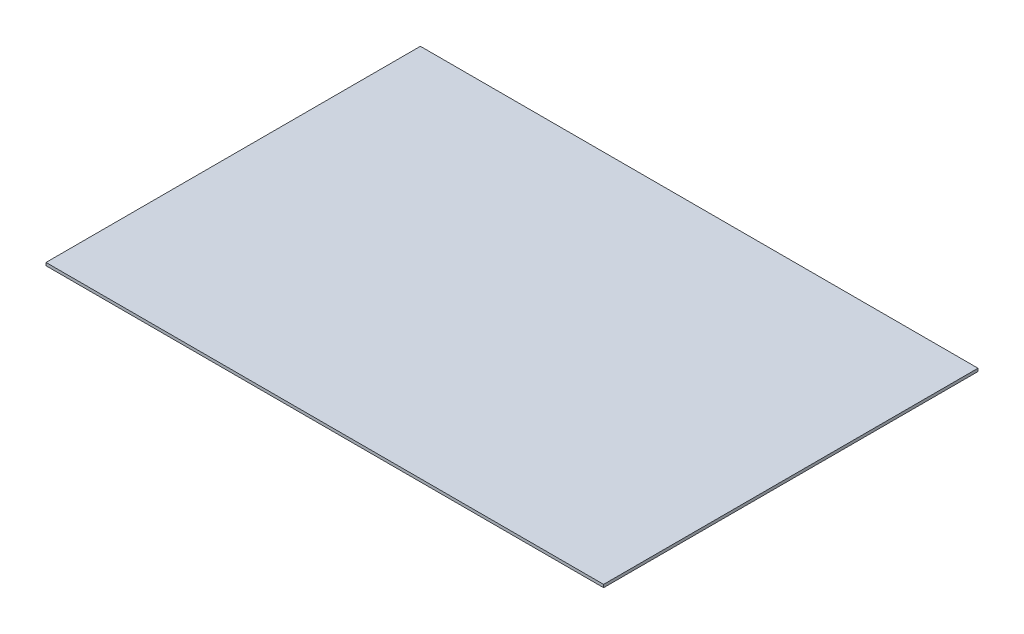
ISO-10303-21;
HEADER;
FILE_DESCRIPTION(('STEP AP214'),'2;1');
FILE_NAME('part.step','',(''),(''),'','','');
FILE_SCHEMA(('AUTOMOTIVE_DESIGN { 1 0 10303 214 1 1 1 1 }'));
ENDSEC;
DATA;
#1=APPLICATION_CONTEXT('core data for automotive mechanical design processes');
#2=APPLICATION_PROTOCOL_DEFINITION('international standard','automotive_design',2000,#1);
#3=PRODUCT_CONTEXT('',#1,'mechanical');
#4=PRODUCT('Part','Part','',(#3));
#5=PRODUCT_RELATED_PRODUCT_CATEGORY('part','',(#4));
#6=PRODUCT_DEFINITION_FORMATION('','',#4);
#7=PRODUCT_DEFINITION_CONTEXT('part definition',#1,'design');
#8=PRODUCT_DEFINITION('design','',#6,#7);
#9=PRODUCT_DEFINITION_SHAPE('','',#8);
#10=(LENGTH_UNIT() NAMED_UNIT(*) SI_UNIT(.MILLI.,.METRE.));
#11=(NAMED_UNIT(*) PLANE_ANGLE_UNIT() SI_UNIT($,.RADIAN.));
#12=(NAMED_UNIT(*) SI_UNIT($,.STERADIAN.) SOLID_ANGLE_UNIT());
#13=UNCERTAINTY_MEASURE_WITH_UNIT(LENGTH_MEASURE(1.E-05),#10,'distance_accuracy_value','');
#14=(GEOMETRIC_REPRESENTATION_CONTEXT(3) GLOBAL_UNCERTAINTY_ASSIGNED_CONTEXT((#13)) GLOBAL_UNIT_ASSIGNED_CONTEXT((#10,
#11,#12)) REPRESENTATION_CONTEXT('',''));
#15=CARTESIAN_POINT('',(0.,0.,0.));
#16=DIRECTION('',(0.,0.,1.));
#17=DIRECTION('',(1.,0.,0.));
#18=AXIS2_PLACEMENT_3D('',#15,#16,#17);
#19=CARTESIAN_POINT('',(456.504,-2.38125,0.));
#20=DIRECTION('',(1.,0.,0.));
#21=DIRECTION('',(0.,0.,-1.));
#22=AXIS2_PLACEMENT_3D('',#19,#20,#21);
#23=PLANE('',#22);
#24=DIRECTION('',(0.,0.,-1.));
#25=VECTOR('',#24,1.);
#26=CARTESIAN_POINT('',(456.504,2.38125,0.));
#27=LINE('',#26,#25);
#28=CARTESIAN_POINT('',(456.504,2.38125,306.504));
#29=VERTEX_POINT('',#28);
#30=CARTESIAN_POINT('',(456.504,2.38125,-306.504));
#31=VERTEX_POINT('',#30);
#32=EDGE_CURVE('E10',#29,#31,#27,.T.);
#33=ORIENTED_EDGE('',*,*,#32,.F.);
#34=DIRECTION('',(0.,1.,0.));
#35=VECTOR('',#34,1.);
#36=CARTESIAN_POINT('',(456.504,-2.38125,306.504));
#37=LINE('',#36,#35);
#38=CARTESIAN_POINT('',(456.504,-2.38125,306.504));
#39=VERTEX_POINT('',#38);
#40=EDGE_CURVE('E23',#39,#29,#37,.T.);
#41=ORIENTED_EDGE('',*,*,#40,.F.);
#42=DIRECTION('',(0.,0.,-1.));
#43=VECTOR('',#42,1.);
#44=CARTESIAN_POINT('',(456.504,-2.38125,0.));
#45=LINE('',#44,#43);
#46=CARTESIAN_POINT('',(456.504,-2.38125,-306.504));
#47=VERTEX_POINT('',#46);
#48=EDGE_CURVE('E85',#39,#47,#45,.T.);
#49=ORIENTED_EDGE('',*,*,#48,.T.);
#50=DIRECTION('',(0.,1.,0.));
#51=VECTOR('',#50,1.);
#52=CARTESIAN_POINT('',(456.504,-2.38125,-306.504));
#53=LINE('',#52,#51);
#54=EDGE_CURVE('E68',#47,#31,#53,.T.);
#55=ORIENTED_EDGE('',*,*,#54,.T.);
#56=EDGE_LOOP('',(#33,#41,#49,#55));
#57=FACE_BOUND('',#56,.T.);
#58=ADVANCED_FACE('F16',(#57),#23,.T.);
#59=CARTESIAN_POINT('',(0.,-2.38125,306.504));
#60=DIRECTION('',(0.,0.,-1.));
#61=DIRECTION('',(-1.,0.,0.));
#62=AXIS2_PLACEMENT_3D('',#59,#60,#61);
#63=PLANE('',#62);
#64=DIRECTION('',(-1.,0.,0.));
#65=VECTOR('',#64,1.);
#66=CARTESIAN_POINT('',(0.,2.38125,306.504));
#67=LINE('',#66,#65);
#68=CARTESIAN_POINT('',(-456.504,2.38125,306.504));
#69=VERTEX_POINT('',#68);
#70=EDGE_CURVE('E82',#29,#69,#67,.T.);
#71=ORIENTED_EDGE('',*,*,#70,.T.);
#72=DIRECTION('',(0.,1.,0.));
#73=VECTOR('',#72,1.);
#74=CARTESIAN_POINT('',(-456.504,-2.38125,306.504));
#75=LINE('',#74,#73);
#76=CARTESIAN_POINT('',(-456.504,-2.38125,306.504));
#77=VERTEX_POINT('',#76);
#78=EDGE_CURVE('E80',#77,#69,#75,.T.);
#79=ORIENTED_EDGE('',*,*,#78,.F.);
#80=DIRECTION('',(-1.,0.,0.));
#81=VECTOR('',#80,1.);
#82=CARTESIAN_POINT('',(0.,-2.38125,306.504));
#83=LINE('',#82,#81);
#84=EDGE_CURVE('E74',#39,#77,#83,.T.);
#85=ORIENTED_EDGE('',*,*,#84,.F.);
#86=ORIENTED_EDGE('',*,*,#40,.T.);
#87=EDGE_LOOP('',(#71,#79,#85,#86));
#88=FACE_BOUND('',#87,.T.);
#89=ADVANCED_FACE('F88',(#88),#63,.F.);
#90=CARTESIAN_POINT('',(-456.504,-2.38125,0.));
#91=DIRECTION('',(1.,0.,0.));
#92=DIRECTION('',(0.,0.,-1.));
#93=AXIS2_PLACEMENT_3D('',#90,#91,#92);
#94=PLANE('',#93);
#95=DIRECTION('',(0.,0.,-1.));
#96=VECTOR('',#95,1.);
#97=CARTESIAN_POINT('',(-456.504,2.38125,0.));
#98=LINE('',#97,#96);
#99=CARTESIAN_POINT('',(-456.504,2.38125,-306.504));
#100=VERTEX_POINT('',#99);
#101=EDGE_CURVE('E59',#69,#100,#98,.T.);
#102=ORIENTED_EDGE('',*,*,#101,.T.);
#103=DIRECTION('',(0.,1.,0.));
#104=VECTOR('',#103,1.);
#105=CARTESIAN_POINT('',(-456.504,-2.38125,-306.504));
#106=LINE('',#105,#104);
#107=CARTESIAN_POINT('',(-456.504,-2.38125,-306.504));
#108=VERTEX_POINT('',#107);
#109=EDGE_CURVE('E51',#108,#100,#106,.T.);
#110=ORIENTED_EDGE('',*,*,#109,.F.);
#111=DIRECTION('',(0.,0.,-1.));
#112=VECTOR('',#111,1.);
#113=CARTESIAN_POINT('',(-456.504,-2.38125,0.));
#114=LINE('',#113,#112);
#115=EDGE_CURVE('E56',#77,#108,#114,.T.);
#116=ORIENTED_EDGE('',*,*,#115,.F.);
#117=ORIENTED_EDGE('',*,*,#78,.T.);
#118=EDGE_LOOP('',(#102,#110,#116,#117));
#119=FACE_BOUND('',#118,.T.);
#120=ADVANCED_FACE('F53',(#119),#94,.F.);
#121=CARTESIAN_POINT('',(0.,-2.38125,-306.504));
#122=DIRECTION('',(0.,0.,-1.));
#123=DIRECTION('',(-1.,0.,0.));
#124=AXIS2_PLACEMENT_3D('',#121,#122,#123);
#125=PLANE('',#124);
#126=DIRECTION('',(-1.,0.,0.));
#127=VECTOR('',#126,1.);
#128=CARTESIAN_POINT('',(0.,2.38125,-306.504));
#129=LINE('',#128,#127);
#130=EDGE_CURVE('E71',#31,#100,#129,.T.);
#131=ORIENTED_EDGE('',*,*,#130,.F.);
#132=ORIENTED_EDGE('',*,*,#54,.F.);
#133=DIRECTION('',(-1.,0.,0.));
#134=VECTOR('',#133,1.);
#135=CARTESIAN_POINT('',(0.,-2.38125,-306.504));
#136=LINE('',#135,#134);
#137=EDGE_CURVE('E66',#47,#108,#136,.T.);
#138=ORIENTED_EDGE('',*,*,#137,.T.);
#139=ORIENTED_EDGE('',*,*,#109,.T.);
#140=EDGE_LOOP('',(#131,#132,#138,#139));
#141=FACE_BOUND('',#140,.T.);
#142=ADVANCED_FACE('F67',(#141),#125,.T.);
#143=CARTESIAN_POINT('',(0.,-2.38125,-1.11022302462516E-13));
#144=DIRECTION('',(0.,-1.,0.));
#145=DIRECTION('',(1.,0.,0.));
#146=AXIS2_PLACEMENT_3D('',#143,#144,#145);
#147=PLANE('',#146);
#148=ORIENTED_EDGE('',*,*,#48,.F.);
#149=ORIENTED_EDGE('',*,*,#84,.T.);
#150=ORIENTED_EDGE('',*,*,#115,.T.);
#151=ORIENTED_EDGE('',*,*,#137,.F.);
#152=EDGE_LOOP('',(#148,#149,#150,#151));
#153=FACE_BOUND('',#152,.T.);
#154=ADVANCED_FACE('F73',(#153),#147,.T.);
#155=CARTESIAN_POINT('',(0.,2.38125,-1.11022302462516E-13));
#156=DIRECTION('',(0.,-1.,0.));
#157=DIRECTION('',(1.,0.,0.));
#158=AXIS2_PLACEMENT_3D('',#155,#156,#157);
#159=PLANE('',#158);
#160=ORIENTED_EDGE('',*,*,#32,.T.);
#161=ORIENTED_EDGE('',*,*,#130,.T.);
#162=ORIENTED_EDGE('',*,*,#101,.F.);
#163=ORIENTED_EDGE('',*,*,#70,.F.);
#164=EDGE_LOOP('',(#160,#161,#162,#163));
#165=FACE_BOUND('',#164,.T.);
#166=ADVANCED_FACE('F90',(#165),#159,.F.);
#167=CLOSED_SHELL('',(#58,#89,#120,#142,#154,#166));
#168=MANIFOLD_SOLID_BREP('B1',#167);
#169=ADVANCED_BREP_SHAPE_REPRESENTATION('',(#18,#168),#14);
#170=SHAPE_DEFINITION_REPRESENTATION(#9,#169);
ENDSEC;
END-ISO-10303-21;
